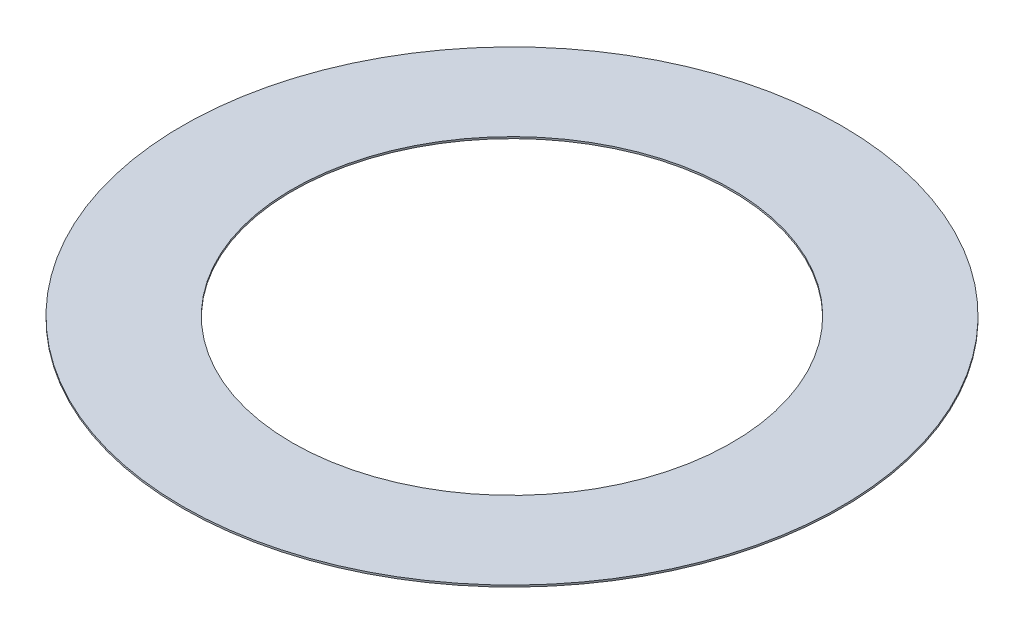
ISO-10303-21;
HEADER;
FILE_DESCRIPTION(('STEP AP214'),'2;1');
FILE_NAME('part.step','',(''),(''),'','','');
FILE_SCHEMA(('AUTOMOTIVE_DESIGN { 1 0 10303 214 1 1 1 1 }'));
ENDSEC;
DATA;
#1=APPLICATION_CONTEXT('core data for automotive mechanical design processes');
#2=APPLICATION_PROTOCOL_DEFINITION('international standard','automotive_design',2000,#1);
#3=PRODUCT_CONTEXT('',#1,'mechanical');
#4=PRODUCT('Part','Part','',(#3));
#5=PRODUCT_RELATED_PRODUCT_CATEGORY('part','',(#4));
#6=PRODUCT_DEFINITION_FORMATION('','',#4);
#7=PRODUCT_DEFINITION_CONTEXT('part definition',#1,'design');
#8=PRODUCT_DEFINITION('design','',#6,#7);
#9=PRODUCT_DEFINITION_SHAPE('','',#8);
#10=(LENGTH_UNIT() NAMED_UNIT(*) SI_UNIT(.MILLI.,.METRE.));
#11=(NAMED_UNIT(*) PLANE_ANGLE_UNIT() SI_UNIT($,.RADIAN.));
#12=(NAMED_UNIT(*) SI_UNIT($,.STERADIAN.) SOLID_ANGLE_UNIT());
#13=UNCERTAINTY_MEASURE_WITH_UNIT(LENGTH_MEASURE(1.E-05),#10,'distance_accuracy_value','');
#14=(GEOMETRIC_REPRESENTATION_CONTEXT(3) GLOBAL_UNCERTAINTY_ASSIGNED_CONTEXT((#13)) GLOBAL_UNIT_ASSIGNED_CONTEXT((#10,
#11,#12)) REPRESENTATION_CONTEXT('',''));
#15=CARTESIAN_POINT('',(0.,0.,0.));
#16=DIRECTION('',(0.,0.,1.));
#17=DIRECTION('',(1.,0.,0.));
#18=AXIS2_PLACEMENT_3D('',#15,#16,#17);
#19=CARTESIAN_POINT('',(0.,0.0254,0.));
#20=DIRECTION('',(0.,1.,0.));
#21=DIRECTION('',(0.,0.,1.));
#22=AXIS2_PLACEMENT_3D('',#19,#20,#21);
#23=PLANE('',#22);
#24=CARTESIAN_POINT('',(0.,0.0254,0.));
#25=DIRECTION('',(0.,1.,0.));
#26=DIRECTION('',(0.,0.,1.));
#27=AXIS2_PLACEMENT_3D('',#24,#25,#26);
#28=CIRCLE('',#27,4.7625);
#29=CARTESIAN_POINT('',(0.,0.0254,4.7625));
#30=VERTEX_POINT('',#29);
#31=EDGE_CURVE('E10',#30,#30,#28,.T.);
#32=ORIENTED_EDGE('',*,*,#31,.T.);
#33=EDGE_LOOP('',(#32));
#34=FACE_BOUND('',#33,.T.);
#35=CARTESIAN_POINT('',(0.,0.0254,0.));
#36=DIRECTION('',(0.,1.,0.));
#37=DIRECTION('',(0.,0.,1.));
#38=AXIS2_PLACEMENT_3D('',#35,#36,#37);
#39=CIRCLE('',#38,3.175);
#40=CARTESIAN_POINT('',(0.,0.0254,3.175));
#41=VERTEX_POINT('',#40);
#42=EDGE_CURVE('E42',#41,#41,#39,.T.);
#43=ORIENTED_EDGE('',*,*,#42,.F.);
#44=EDGE_LOOP('',(#43));
#45=FACE_BOUND('',#44,.T.);
#46=ADVANCED_FACE('F31',(#34,#45),#23,.T.);
#47=CARTESIAN_POINT('',(0.,0.,0.));
#48=DIRECTION('',(0.,1.,0.));
#49=DIRECTION('',(0.,0.,1.));
#50=AXIS2_PLACEMENT_3D('',#47,#48,#49);
#51=PLANE('',#50);
#52=CARTESIAN_POINT('',(0.,0.,0.));
#53=DIRECTION('',(0.,1.,0.));
#54=DIRECTION('',(0.,0.,1.));
#55=AXIS2_PLACEMENT_3D('',#52,#53,#54);
#56=CIRCLE('',#55,4.7625);
#57=CARTESIAN_POINT('',(0.,0.,4.7625));
#58=VERTEX_POINT('',#57);
#59=EDGE_CURVE('E35',#58,#58,#56,.T.);
#60=ORIENTED_EDGE('',*,*,#59,.F.);
#61=EDGE_LOOP('',(#60));
#62=FACE_BOUND('',#61,.T.);
#63=CARTESIAN_POINT('',(0.,0.,0.));
#64=DIRECTION('',(0.,1.,0.));
#65=DIRECTION('',(0.,0.,1.));
#66=AXIS2_PLACEMENT_3D('',#63,#64,#65);
#67=CIRCLE('',#66,3.175);
#68=CARTESIAN_POINT('',(0.,0.,3.175));
#69=VERTEX_POINT('',#68);
#70=EDGE_CURVE('E44',#69,#69,#67,.T.);
#71=ORIENTED_EDGE('',*,*,#70,.T.);
#72=EDGE_LOOP('',(#71));
#73=FACE_BOUND('',#72,.T.);
#74=ADVANCED_FACE('F54',(#62,#73),#51,.F.);
#75=CARTESIAN_POINT('',(0.,0.0254,0.));
#76=DIRECTION('',(0.,-1.,0.));
#77=DIRECTION('',(0.,0.,-1.));
#78=AXIS2_PLACEMENT_3D('',#75,#76,#77);
#79=CYLINDRICAL_SURFACE('',#78,4.7625);
#80=ORIENTED_EDGE('',*,*,#31,.F.);
#81=EDGE_LOOP('',(#80));
#82=FACE_BOUND('',#81,.T.);
#83=ORIENTED_EDGE('',*,*,#59,.T.);
#84=EDGE_LOOP('',(#83));
#85=FACE_BOUND('',#84,.T.);
#86=ADVANCED_FACE('F33',(#82,#85),#79,.T.);
#87=CARTESIAN_POINT('',(0.,0.0254,0.));
#88=DIRECTION('',(0.,-1.,0.));
#89=DIRECTION('',(0.,0.,-1.));
#90=AXIS2_PLACEMENT_3D('',#87,#88,#89);
#91=CYLINDRICAL_SURFACE('',#90,3.175);
#92=ORIENTED_EDGE('',*,*,#42,.T.);
#93=EDGE_LOOP('',(#92));
#94=FACE_BOUND('',#93,.T.);
#95=ORIENTED_EDGE('',*,*,#70,.F.);
#96=EDGE_LOOP('',(#95));
#97=FACE_BOUND('',#96,.T.);
#98=ADVANCED_FACE('F50',(#94,#97),#91,.F.);
#99=CLOSED_SHELL('',(#46,#74,#86,#98));
#100=MANIFOLD_SOLID_BREP('B2',#99);
#101=ADVANCED_BREP_SHAPE_REPRESENTATION('',(#18,#100),#14);
#102=SHAPE_DEFINITION_REPRESENTATION(#9,#101);
ENDSEC;
END-ISO-10303-21;
